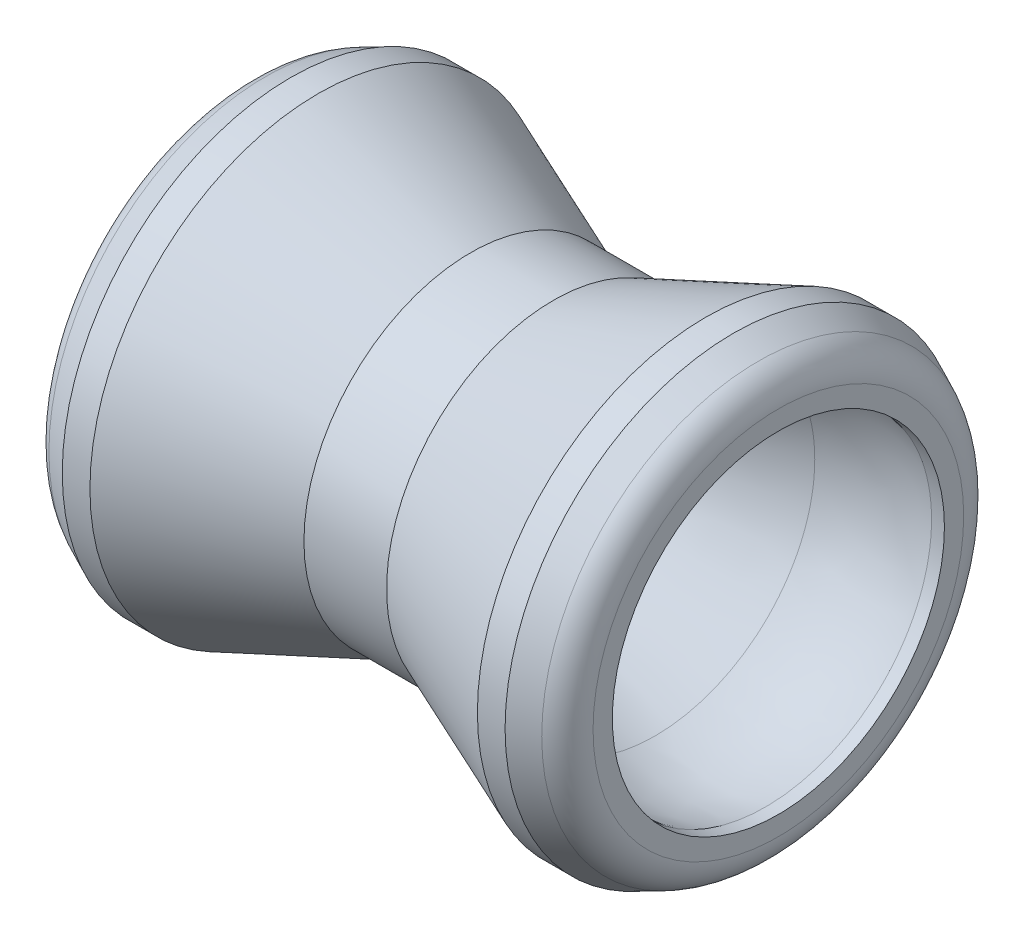
ISO-10303-21;
HEADER;
FILE_DESCRIPTION(('STEP AP214'),'2;1');
FILE_NAME('part.step','',(''),(''),'','','');
FILE_SCHEMA(('AUTOMOTIVE_DESIGN { 1 0 10303 214 1 1 1 1 }'));
ENDSEC;
DATA;
#1=APPLICATION_CONTEXT('core data for automotive mechanical design processes');
#2=APPLICATION_PROTOCOL_DEFINITION('international standard','automotive_design',2000,#1);
#3=PRODUCT_CONTEXT('',#1,'mechanical');
#4=PRODUCT('Part','Part','',(#3));
#5=PRODUCT_RELATED_PRODUCT_CATEGORY('part','',(#4));
#6=PRODUCT_DEFINITION_FORMATION('','',#4);
#7=PRODUCT_DEFINITION_CONTEXT('part definition',#1,'design');
#8=PRODUCT_DEFINITION('design','',#6,#7);
#9=PRODUCT_DEFINITION_SHAPE('','',#8);
#10=(LENGTH_UNIT() NAMED_UNIT(*) SI_UNIT(.MILLI.,.METRE.));
#11=(NAMED_UNIT(*) PLANE_ANGLE_UNIT() SI_UNIT($,.RADIAN.));
#12=(NAMED_UNIT(*) SI_UNIT($,.STERADIAN.) SOLID_ANGLE_UNIT());
#13=UNCERTAINTY_MEASURE_WITH_UNIT(LENGTH_MEASURE(1.E-05),#10,'distance_accuracy_value','');
#14=(GEOMETRIC_REPRESENTATION_CONTEXT(3) GLOBAL_UNCERTAINTY_ASSIGNED_CONTEXT((#13)) GLOBAL_UNIT_ASSIGNED_CONTEXT((#10,
#11,#12)) REPRESENTATION_CONTEXT('',''));
#15=CARTESIAN_POINT('',(0.,0.,0.));
#16=DIRECTION('',(0.,0.,1.));
#17=DIRECTION('',(1.,0.,0.));
#18=AXIS2_PLACEMENT_3D('',#15,#16,#17);
#19=CARTESIAN_POINT('',(-15.3949810712106,0.,0.));
#20=DIRECTION('',(-1.,0.,0.));
#21=DIRECTION('',(0.,0.,1.));
#22=AXIS2_PLACEMENT_3D('',#19,#20,#21);
#23=CONICAL_SURFACE('',#22,4.22106090000085,0.0220636833265446);
#24=CARTESIAN_POINT('',(-15.394981071271,0.,0.));
#25=DIRECTION('',(1.,0.,0.));
#26=DIRECTION('',(0.,0.,-1.));
#27=AXIS2_PLACEMENT_3D('',#24,#25,#26);
#28=CIRCLE('',#27,4.22106090000002);
#29=CARTESIAN_POINT('',(-15.394981071271,0.,-4.22106090000002));
#30=VERTEX_POINT('',#29);
#31=EDGE_CURVE('E91',#30,#30,#28,.T.);
#32=ORIENTED_EDGE('',*,*,#31,.F.);
#33=EDGE_LOOP('',(#32));
#34=FACE_BOUND('',#33,.T.);
#35=CARTESIAN_POINT('',(-9.81825898657007,0.,0.));
#36=DIRECTION('',(-1.,0.,0.));
#37=DIRECTION('',(0.,0.,1.));
#38=AXIS2_PLACEMENT_3D('',#35,#36,#37);
#39=CIRCLE('',#38,4.09799790000316);
#40=CARTESIAN_POINT('',(-9.81825898657007,0.,4.09799790000316));
#41=VERTEX_POINT('',#40);
#42=EDGE_CURVE('E92',#41,#41,#39,.T.);
#43=ORIENTED_EDGE('',*,*,#42,.F.);
#44=EDGE_LOOP('',(#43));
#45=FACE_BOUND('',#44,.T.);
#46=ADVANCED_FACE('F17',(#34,#45),#23,.F.);
#47=CARTESIAN_POINT('',(-9.81825898657293,0.,0.));
#48=DIRECTION('',(1.,0.,0.));
#49=DIRECTION('',(0.,0.,-1.));
#50=AXIS2_PLACEMENT_3D('',#47,#48,#49);
#51=PLANE('',#50);
#52=ORIENTED_EDGE('',*,*,#42,.T.);
#53=EDGE_LOOP('',(#52));
#54=FACE_BOUND('',#53,.T.);
#55=CARTESIAN_POINT('',(-9.81825898657293,0.,0.));
#56=DIRECTION('',(1.,0.,0.));
#57=DIRECTION('',(0.,0.,-1.));
#58=AXIS2_PLACEMENT_3D('',#55,#56,#57);
#59=CIRCLE('',#58,4.4056554);
#60=CARTESIAN_POINT('',(-9.81825898657293,0.,-4.4056554));
#61=VERTEX_POINT('',#60);
#62=EDGE_CURVE('E88',#61,#61,#59,.T.);
#63=ORIENTED_EDGE('',*,*,#62,.T.);
#64=EDGE_LOOP('',(#63));
#65=FACE_BOUND('',#64,.T.);
#66=ADVANCED_FACE('F273',(#54,#65),#51,.T.);
#67=CARTESIAN_POINT('',(-15.3906370668411,0.,0.));
#68=DIRECTION('',(1.,0.,0.));
#69=DIRECTION('',(0.,0.,-1.));
#70=AXIS2_PLACEMENT_3D('',#67,#68,#69);
#71=TOROIDAL_SURFACE('',#70,4.41791377568679,0.1969008);
#72=ORIENTED_EDGE('',*,*,#31,.T.);
#73=EDGE_LOOP('',(#72));
#74=FACE_BOUND('',#73,.T.);
#75=CARTESIAN_POINT('',(-15.4653340532218,0.,0.));
#76=DIRECTION('',(1.,0.,0.));
#77=DIRECTION('',(0.,0.,-1.));
#78=AXIS2_PLACEMENT_3D('',#75,#76,#77);
#79=CIRCLE('',#78,4.23573176431827);
#80=CARTESIAN_POINT('',(-15.4653340532218,0.,-4.23573176431827));
#81=VERTEX_POINT('',#80);
#82=EDGE_CURVE('E71',#81,#81,#79,.F.);
#83=ORIENTED_EDGE('',*,*,#82,.T.);
#84=EDGE_LOOP('',(#83));
#85=FACE_BOUND('',#84,.T.);
#86=ADVANCED_FACE('F270',(#74,#85),#71,.T.);
#87=CARTESIAN_POINT('',(-0.342407986572929,0.,0.));
#88=DIRECTION('',(1.,0.,0.));
#89=DIRECTION('',(0.,0.,-1.));
#90=AXIS2_PLACEMENT_3D('',#87,#88,#89);
#91=CYLINDRICAL_SURFACE('',#90,4.4056554);
#92=ORIENTED_EDGE('',*,*,#62,.F.);
#93=EDGE_LOOP('',(#92));
#94=FACE_BOUND('',#93,.T.);
#95=CARTESIAN_POINT('',(-7.89002856913612,0.,0.));
#96=DIRECTION('',(1.,0.,0.));
#97=DIRECTION('',(0.,0.,-1.));
#98=AXIS2_PLACEMENT_3D('',#95,#96,#97);
#99=CIRCLE('',#98,4.40565539997806);
#100=CARTESIAN_POINT('',(-7.89002856913612,0.,-4.40565539997806));
#101=VERTEX_POINT('',#100);
#102=EDGE_CURVE('E78',#101,#101,#99,.T.);
#103=ORIENTED_EDGE('',*,*,#102,.T.);
#104=EDGE_LOOP('',(#103));
#105=FACE_BOUND('',#104,.T.);
#106=ADVANCED_FACE('F67',(#94,#105),#91,.F.);
#107=CARTESIAN_POINT('',(-17.202038986573,0.,0.));
#108=DIRECTION('',(0.,0.,-1.));
#109=DIRECTION('',(-1.,0.,0.));
#110=AXIS2_PLACEMENT_3D('',#107,#108,#109);
#111=SPHERICAL_SURFACE('',#110,4.5779436);
#112=CARTESIAN_POINT('',(-17.202038986573,0.,-4.5779436));
#113=VERTEX_POINT('',#112);
#114=VERTEX_LOOP('',#113);
#115=FACE_BOUND('',#114,.T.);
#116=ORIENTED_EDGE('',*,*,#82,.F.);
#117=EDGE_LOOP('',(#116));
#118=FACE_BOUND('',#117,.T.);
#119=CARTESIAN_POINT('',(-17.202038986573,0.,4.5779436));
#120=VERTEX_POINT('',#119);
#121=VERTEX_LOOP('',#120);
#122=FACE_BOUND('',#121,.T.);
#123=CARTESIAN_POINT('',(-18.6170618351128,0.,0.));
#124=DIRECTION('',(1.,0.,0.));
#125=DIRECTION('',(0.,0.,-1.));
#126=AXIS2_PLACEMENT_3D('',#123,#124,#125);
#127=CIRCLE('',#126,4.35376594948453);
#128=CARTESIAN_POINT('',(-18.6170618351128,0.,-4.35376594948453));
#129=VERTEX_POINT('',#128);
#130=EDGE_CURVE('E75',#129,#129,#127,.T.);
#131=ORIENTED_EDGE('',*,*,#130,.F.);
#132=EDGE_LOOP('',(#131));
#133=FACE_BOUND('',#132,.T.);
#134=ADVANCED_FACE('F63',(#115,#118,#122,#133),#111,.F.);
#135=CARTESIAN_POINT('',(-4.73026950459143,0.,0.));
#136=DIRECTION('',(1.,0.,0.));
#137=DIRECTION('',(0.,0.,-1.));
#138=AXIS2_PLACEMENT_3D('',#135,#136,#137);
#139=CONICAL_SURFACE('',#138,5.68228092936352,0.383972435435771);
#140=ORIENTED_EDGE('',*,*,#102,.F.);
#141=EDGE_LOOP('',(#140));
#142=FACE_BOUND('',#141,.T.);
#143=CARTESIAN_POINT('',(-4.73026950459143,0.,0.));
#144=DIRECTION('',(1.,0.,0.));
#145=DIRECTION('',(0.,0.,-1.));
#146=AXIS2_PLACEMENT_3D('',#143,#144,#145);
#147=CIRCLE('',#146,5.68228092936352);
#148=CARTESIAN_POINT('',(-4.73026950459143,0.,-5.68228092936352));
#149=VERTEX_POINT('',#148);
#150=EDGE_CURVE('E77',#149,#149,#147,.T.);
#151=ORIENTED_EDGE('',*,*,#150,.T.);
#152=EDGE_LOOP('',(#151));
#153=FACE_BOUND('',#152,.T.);
#154=ADVANCED_FACE('F66',(#142,#153),#139,.F.);
#155=CARTESIAN_POINT('',(-18.6779230328995,0.,0.));
#156=DIRECTION('',(1.,0.,0.));
#157=DIRECTION('',(0.,0.,-1.));
#158=AXIS2_PLACEMENT_3D('',#155,#156,#157);
#159=TOROIDAL_SURFACE('',#158,4.5410247,0.1969008);
#160=ORIENTED_EDGE('',*,*,#130,.T.);
#161=EDGE_LOOP('',(#160));
#162=FACE_BOUND('',#161,.T.);
#163=CARTESIAN_POINT('',(-18.6779230328995,0.,0.));
#164=DIRECTION('',(1.,0.,0.));
#165=DIRECTION('',(0.,0.,-1.));
#166=AXIS2_PLACEMENT_3D('',#163,#164,#165);
#167=CIRCLE('',#166,4.3441239);
#168=CARTESIAN_POINT('',(-18.6779230328995,0.,-4.3441239));
#169=VERTEX_POINT('',#168);
#170=EDGE_CURVE('E81',#169,#169,#167,.F.);
#171=ORIENTED_EDGE('',*,*,#170,.T.);
#172=EDGE_LOOP('',(#171));
#173=FACE_BOUND('',#172,.T.);
#174=ADVANCED_FACE('F259',(#162,#173),#159,.T.);
#175=CARTESIAN_POINT('',(-2.43447898657293,0.,0.));
#176=DIRECTION('',(0.,0.,-1.));
#177=DIRECTION('',(-1.,0.,0.));
#178=AXIS2_PLACEMENT_3D('',#175,#176,#177);
#179=SPHERICAL_SURFACE('',#178,6.1285374);
#180=CARTESIAN_POINT('',(-2.43447898657293,0.,-6.1285374));
#181=VERTEX_POINT('',#180);
#182=VERTEX_LOOP('',#181);
#183=FACE_BOUND('',#182,.T.);
#184=ORIENTED_EDGE('',*,*,#150,.F.);
#185=EDGE_LOOP('',(#184));
#186=FACE_BOUND('',#185,.T.);
#187=CARTESIAN_POINT('',(-2.43447898657293,0.,6.1285374));
#188=VERTEX_POINT('',#187);
#189=VERTEX_LOOP('',#188);
#190=FACE_BOUND('',#189,.T.);
#191=CARTESIAN_POINT('',(-0.801678286357883,0.,0.));
#192=DIRECTION('',(1.,0.,0.));
#193=DIRECTION('',(0.,0.,-1.));
#194=AXIS2_PLACEMENT_3D('',#191,#192,#193);
#195=CIRCLE('',#194,5.907024);
#196=CARTESIAN_POINT('',(-0.801678286357883,0.,-5.907024));
#197=VERTEX_POINT('',#196);
#198=EDGE_CURVE('E250',#197,#197,#195,.T.);
#199=ORIENTED_EDGE('',*,*,#198,.T.);
#200=EDGE_LOOP('',(#199));
#201=FACE_BOUND('',#200,.T.);
#202=ADVANCED_FACE('F255',(#183,#186,#190,#201),#179,.F.);
#203=CARTESIAN_POINT('',(-0.342407986572929,0.,0.));
#204=DIRECTION('',(1.,0.,0.));
#205=DIRECTION('',(0.,0.,-1.));
#206=AXIS2_PLACEMENT_3D('',#203,#204,#205);
#207=CYLINDRICAL_SURFACE('',#206,4.3441239);
#208=ORIENTED_EDGE('',*,*,#170,.F.);
#209=EDGE_LOOP('',(#208));
#210=FACE_BOUND('',#209,.T.);
#211=CARTESIAN_POINT('',(-19.0156502047708,0.,0.));
#212=DIRECTION('',(1.,0.,0.));
#213=DIRECTION('',(0.,0.,-1.));
#214=AXIS2_PLACEMENT_3D('',#211,#212,#213);
#215=CIRCLE('',#214,4.3441239);
#216=CARTESIAN_POINT('',(-19.0156502047708,0.,-4.3441239));
#217=VERTEX_POINT('',#216);
#218=EDGE_CURVE('E247',#217,#217,#215,.T.);
#219=ORIENTED_EDGE('',*,*,#218,.F.);
#220=EDGE_LOOP('',(#219));
#221=FACE_BOUND('',#220,.T.);
#222=ADVANCED_FACE('F258',(#210,#221),#207,.F.);
#223=CARTESIAN_POINT('',(-0.342407986572929,0.,0.));
#224=DIRECTION('',(1.,0.,0.));
#225=DIRECTION('',(0.,0.,-1.));
#226=AXIS2_PLACEMENT_3D('',#223,#224,#225);
#227=CYLINDRICAL_SURFACE('',#226,5.907024);
#228=ORIENTED_EDGE('',*,*,#198,.F.);
#229=EDGE_LOOP('',(#228));
#230=FACE_BOUND('',#229,.T.);
#231=CARTESIAN_POINT('',(-0.342407986572929,0.,0.));
#232=DIRECTION('',(1.,0.,0.));
#233=DIRECTION('',(0.,0.,-1.));
#234=AXIS2_PLACEMENT_3D('',#231,#232,#233);
#235=CIRCLE('',#234,5.907024);
#236=CARTESIAN_POINT('',(-0.342407986572929,0.,-5.907024));
#237=VERTEX_POINT('',#236);
#238=EDGE_CURVE('E246',#237,#237,#235,.T.);
#239=ORIENTED_EDGE('',*,*,#238,.T.);
#240=EDGE_LOOP('',(#239));
#241=FACE_BOUND('',#240,.T.);
#242=ADVANCED_FACE('F237',(#230,#241),#227,.F.);
#243=CARTESIAN_POINT('',(-19.0156502047708,0.,0.));
#244=DIRECTION('',(1.,0.,0.));
#245=DIRECTION('',(0.,0.,-1.));
#246=AXIS2_PLACEMENT_3D('',#243,#244,#245);
#247=TOROIDAL_SURFACE('',#246,4.5410247,0.1969008);
#248=ORIENTED_EDGE('',*,*,#218,.T.);
#249=EDGE_LOOP('',(#248));
#250=FACE_BOUND('',#249,.T.);
#251=CARTESIAN_POINT('',(-19.1341480642677,0.,0.));
#252=DIRECTION('',(-1.,0.,0.));
#253=DIRECTION('',(0.,0.,1.));
#254=AXIS2_PLACEMENT_3D('',#251,#252,#253);
#255=CIRCLE('',#254,4.38377272922707);
#256=CARTESIAN_POINT('',(-19.1341480642677,0.,4.38377272922707));
#257=VERTEX_POINT('',#256);
#258=EDGE_CURVE('E210',#257,#257,#255,.T.);
#259=ORIENTED_EDGE('',*,*,#258,.T.);
#260=EDGE_LOOP('',(#259));
#261=FACE_BOUND('',#260,.T.);
#262=ADVANCED_FACE('F232',(#250,#261),#247,.T.);
#263=CARTESIAN_POINT('',(-0.342407986572929,0.,0.));
#264=DIRECTION('',(-1.,0.,0.));
#265=DIRECTION('',(0.,0.,1.));
#266=AXIS2_PLACEMENT_3D('',#263,#264,#265);
#267=PLANE('',#266);
#268=CARTESIAN_POINT('',(-0.34240798657293,0.,0.));
#269=DIRECTION('',(-1.,0.,0.));
#270=DIRECTION('',(0.,0.,-1.));
#271=AXIS2_PLACEMENT_3D('',#268,#269,#270);
#272=CIRCLE('',#271,6.59215237358061);
#273=CARTESIAN_POINT('',(-0.34240798657293,0.,-6.59215237358061));
#274=VERTEX_POINT('',#273);
#275=CARTESIAN_POINT('',(-0.34240798657293,0.,6.59215237358061));
#276=VERTEX_POINT('',#275);
#277=EDGE_CURVE('E203',#274,#276,#272,.T.);
#278=ORIENTED_EDGE('',*,*,#277,.F.);
#279=CARTESIAN_POINT('',(-0.34240798657293,0.,0.));
#280=DIRECTION('',(-1.,0.,0.));
#281=DIRECTION('',(0.,0.,1.));
#282=AXIS2_PLACEMENT_3D('',#279,#280,#281);
#283=CIRCLE('',#282,6.59215237358061);
#284=EDGE_CURVE('E206',#276,#274,#283,.T.);
#285=ORIENTED_EDGE('',*,*,#284,.F.);
#286=EDGE_LOOP('',(#278,#285));
#287=FACE_BOUND('',#286,.T.);
#288=ORIENTED_EDGE('',*,*,#238,.F.);
#289=EDGE_LOOP('',(#288));
#290=FACE_BOUND('',#289,.T.);
#291=ADVANCED_FACE('F212',(#287,#290),#267,.F.);
#292=CARTESIAN_POINT('',(-19.2157070459871,0.,0.));
#293=DIRECTION('',(-1.,0.,0.));
#294=DIRECTION('',(0.,0.,1.));
#295=AXIS2_PLACEMENT_3D('',#292,#293,#294);
#296=CONICAL_SURFACE('',#295,4.44523183017509,0.645771823409847);
#297=CARTESIAN_POINT('',(-19.2157070460836,0.,0.));
#298=DIRECTION('',(1.,0.,0.));
#299=DIRECTION('',(0.,0.,-1.));
#300=AXIS2_PLACEMENT_3D('',#297,#298,#299);
#301=CIRCLE('',#300,4.44523183022253);
#302=CARTESIAN_POINT('',(-19.2157070460836,0.,-4.44523183022253));
#303=VERTEX_POINT('',#302);
#304=EDGE_CURVE('E214',#303,#303,#301,.T.);
#305=ORIENTED_EDGE('',*,*,#304,.F.);
#306=EDGE_LOOP('',(#305));
#307=FACE_BOUND('',#306,.T.);
#308=ORIENTED_EDGE('',*,*,#258,.F.);
#309=EDGE_LOOP('',(#308));
#310=FACE_BOUND('',#309,.T.);
#311=ADVANCED_FACE('F231',(#307,#310),#296,.F.);
#312=CARTESIAN_POINT('',(-1.57303798657293,0.,0.));
#313=DIRECTION('',(1.,0.,0.));
#314=DIRECTION('',(0.,0.,-1.));
#315=AXIS2_PLACEMENT_3D('',#312,#313,#314);
#316=TOROIDAL_SURFACE('',#315,6.59215237358061,1.23063);
#317=ORIENTED_EDGE('',*,*,#277,.T.);
#318=ORIENTED_EDGE('',*,*,#284,.T.);
#319=EDGE_LOOP('',(#317,#318));
#320=FACE_BOUND('',#319,.T.);
#321=CARTESIAN_POINT('',(-1.05295127512698,0.,0.));
#322=DIRECTION('',(-1.,0.,0.));
#323=DIRECTION('',(0.,0.,1.));
#324=AXIS2_PLACEMENT_3D('',#321,#322,#323);
#325=CIRCLE('',#324,7.70748192554153);
#326=CARTESIAN_POINT('',(-1.05295127512698,0.,7.70748192554153));
#327=VERTEX_POINT('',#326);
#328=EDGE_CURVE('E243',#327,#327,#325,.T.);
#329=ORIENTED_EDGE('',*,*,#328,.F.);
#330=EDGE_LOOP('',(#329));
#331=FACE_BOUND('',#330,.T.);
#332=ADVANCED_FACE('F186',(#320,#331),#316,.T.);
#333=CARTESIAN_POINT('',(-19.097209186573,0.,0.));
#334=DIRECTION('',(1.,0.,0.));
#335=DIRECTION('',(0.,0.,-1.));
#336=AXIS2_PLACEMENT_3D('',#333,#334,#335);
#337=TOROIDAL_SURFACE('',#336,4.60248380105924,0.1969008);
#338=ORIENTED_EDGE('',*,*,#304,.T.);
#339=EDGE_LOOP('',(#338));
#340=FACE_BOUND('',#339,.T.);
#341=CARTESIAN_POINT('',(-19.294109986573,0.,0.));
#342=DIRECTION('',(-1.,0.,0.));
#343=DIRECTION('',(0.,0.,-1.));
#344=AXIS2_PLACEMENT_3D('',#341,#342,#343);
#345=CIRCLE('',#344,4.60248380105924);
#346=CARTESIAN_POINT('',(-19.294109986573,0.,4.60248380105924));
#347=VERTEX_POINT('',#346);
#348=CARTESIAN_POINT('',(-19.294109986573,0.,-4.60248380105924));
#349=VERTEX_POINT('',#348);
#350=EDGE_CURVE('E356',#347,#349,#345,.F.);
#351=ORIENTED_EDGE('',*,*,#350,.F.);
#352=CARTESIAN_POINT('',(-19.294109986573,0.,0.));
#353=DIRECTION('',(-1.,0.,0.));
#354=DIRECTION('',(0.,0.,1.));
#355=AXIS2_PLACEMENT_3D('',#352,#353,#354);
#356=CIRCLE('',#355,4.60248380105924);
#357=EDGE_CURVE('E133',#349,#347,#356,.F.);
#358=ORIENTED_EDGE('',*,*,#357,.F.);
#359=EDGE_LOOP('',(#351,#358));
#360=FACE_BOUND('',#359,.T.);
#361=ADVANCED_FACE('F183',(#340,#360),#337,.T.);
#362=CARTESIAN_POINT('',(-1.94222698657293,0.,0.));
#363=DIRECTION('',(-1.,0.,0.));
#364=DIRECTION('',(0.,0.,1.));
#365=AXIS2_PLACEMENT_3D('',#362,#363,#364);
#366=CONICAL_SURFACE('',#365,8.122158,0.436332312998578);
#367=CARTESIAN_POINT('',(-1.94222698657293,0.,0.));
#368=DIRECTION('',(1.,0.,0.));
#369=DIRECTION('',(0.,0.,-1.));
#370=AXIS2_PLACEMENT_3D('',#367,#368,#369);
#371=CIRCLE('',#370,8.122158);
#372=CARTESIAN_POINT('',(-1.94222698657293,0.,-8.122158));
#373=VERTEX_POINT('',#372);
#374=EDGE_CURVE('E125',#373,#373,#371,.F.);
#375=ORIENTED_EDGE('',*,*,#374,.F.);
#376=EDGE_LOOP('',(#375));
#377=FACE_BOUND('',#376,.T.);
#378=ORIENTED_EDGE('',*,*,#328,.T.);
#379=EDGE_LOOP('',(#378));
#380=FACE_BOUND('',#379,.T.);
#381=ADVANCED_FACE('F147',(#377,#380),#366,.T.);
#382=CARTESIAN_POINT('',(-19.294109986573,0.,0.));
#383=DIRECTION('',(-1.,0.,0.));
#384=DIRECTION('',(0.,0.,1.));
#385=AXIS2_PLACEMENT_3D('',#382,#383,#384);
#386=PLANE('',#385);
#387=CARTESIAN_POINT('',(-19.294109986573,0.,0.));
#388=DIRECTION('',(1.,0.,0.));
#389=DIRECTION('',(0.,0.,-1.));
#390=AXIS2_PLACEMENT_3D('',#387,#388,#389);
#391=CIRCLE('',#390,6.59215237358061);
#392=CARTESIAN_POINT('',(-19.294109986573,0.,-6.59215237358061));
#393=VERTEX_POINT('',#392);
#394=CARTESIAN_POINT('',(-19.294109986573,0.,6.59215237358061));
#395=VERTEX_POINT('',#394);
#396=EDGE_CURVE('E128',#393,#395,#391,.T.);
#397=ORIENTED_EDGE('',*,*,#396,.F.);
#398=CARTESIAN_POINT('',(-19.294109986573,0.,0.));
#399=DIRECTION('',(1.,0.,0.));
#400=DIRECTION('',(0.,0.,1.));
#401=AXIS2_PLACEMENT_3D('',#398,#399,#400);
#402=CIRCLE('',#401,6.59215237358061);
#403=EDGE_CURVE('E36',#395,#393,#402,.T.);
#404=ORIENTED_EDGE('',*,*,#403,.F.);
#405=EDGE_LOOP('',(#397,#404));
#406=FACE_BOUND('',#405,.T.);
#407=ORIENTED_EDGE('',*,*,#357,.T.);
#408=ORIENTED_EDGE('',*,*,#350,.T.);
#409=EDGE_LOOP('',(#407,#408));
#410=FACE_BOUND('',#409,.T.);
#411=ADVANCED_FACE('F138',(#406,#410),#386,.T.);
#412=CARTESIAN_POINT('',(-0.342407986572929,0.,0.));
#413=DIRECTION('',(1.,0.,0.));
#414=DIRECTION('',(0.,0.,-1.));
#415=AXIS2_PLACEMENT_3D('',#412,#413,#414);
#416=CYLINDRICAL_SURFACE('',#415,8.122158);
#417=ORIENTED_EDGE('',*,*,#374,.T.);
#418=EDGE_LOOP('',(#417));
#419=FACE_BOUND('',#418,.T.);
#420=CARTESIAN_POINT('',(-2.92673098657293,0.,0.));
#421=DIRECTION('',(1.,0.,0.));
#422=DIRECTION('',(0.,0.,-1.));
#423=AXIS2_PLACEMENT_3D('',#420,#421,#422);
#424=CIRCLE('',#423,8.122158);
#425=CARTESIAN_POINT('',(-2.92673098657293,0.,-8.122158));
#426=VERTEX_POINT('',#425);
#427=EDGE_CURVE('E123',#426,#426,#424,.F.);
#428=ORIENTED_EDGE('',*,*,#427,.F.);
#429=EDGE_LOOP('',(#428));
#430=FACE_BOUND('',#429,.T.);
#431=ADVANCED_FACE('F114',(#419,#430),#416,.T.);
#432=CARTESIAN_POINT('',(-18.063479986573,0.,0.));
#433=DIRECTION('',(1.,0.,0.));
#434=DIRECTION('',(0.,0.,-1.));
#435=AXIS2_PLACEMENT_3D('',#432,#433,#434);
#436=TOROIDAL_SURFACE('',#435,6.59215237358061,1.23063);
#437=CARTESIAN_POINT('',(-18.5835666980189,0.,0.));
#438=DIRECTION('',(1.,0.,0.));
#439=DIRECTION('',(0.,0.,-1.));
#440=AXIS2_PLACEMENT_3D('',#437,#438,#439);
#441=CIRCLE('',#440,7.70748192554152);
#442=CARTESIAN_POINT('',(-18.5835666980189,0.,-7.70748192554152));
#443=VERTEX_POINT('',#442);
#444=EDGE_CURVE('E331',#443,#443,#441,.T.);
#445=ORIENTED_EDGE('',*,*,#444,.F.);
#446=EDGE_LOOP('',(#445));
#447=FACE_BOUND('',#446,.T.);
#448=ORIENTED_EDGE('',*,*,#396,.T.);
#449=ORIENTED_EDGE('',*,*,#403,.T.);
#450=EDGE_LOOP('',(#448,#449));
#451=FACE_BOUND('',#450,.T.);
#452=ADVANCED_FACE('F102',(#447,#451),#436,.T.);
#453=CARTESIAN_POINT('',(-2.92673098657293,0.,0.));
#454=DIRECTION('',(1.,0.,0.));
#455=DIRECTION('',(0.,0.,-1.));
#456=AXIS2_PLACEMENT_3D('',#453,#454,#455);
#457=CONICAL_SURFACE('',#456,8.122158,0.383972435438746);
#458=ORIENTED_EDGE('',*,*,#427,.T.);
#459=EDGE_LOOP('',(#458));
#460=FACE_BOUND('',#459,.T.);
#461=CARTESIAN_POINT('',(-8.3484617058401,0.,0.));
#462=DIRECTION('',(1.,0.,0.));
#463=DIRECTION('',(0.,0.,-1.));
#464=AXIS2_PLACEMENT_3D('',#461,#462,#463);
#465=CIRCLE('',#464,5.9316366);
#466=CARTESIAN_POINT('',(-8.3484617058401,0.,-5.9316366));
#467=VERTEX_POINT('',#466);
#468=EDGE_CURVE('E332',#467,#467,#465,.F.);
#469=ORIENTED_EDGE('',*,*,#468,.F.);
#470=EDGE_LOOP('',(#469));
#471=FACE_BOUND('',#470,.T.);
#472=ADVANCED_FACE('F113',(#460,#471),#457,.T.);
#473=CARTESIAN_POINT('',(-17.6942909865729,0.,0.));
#474=DIRECTION('',(1.,0.,0.));
#475=DIRECTION('',(0.,0.,-1.));
#476=AXIS2_PLACEMENT_3D('',#473,#474,#475);
#477=CONICAL_SURFACE('',#476,8.122158,0.436332312998577);
#478=CARTESIAN_POINT('',(-17.6942909865729,0.,0.));
#479=DIRECTION('',(1.,0.,0.));
#480=DIRECTION('',(0.,0.,-1.));
#481=AXIS2_PLACEMENT_3D('',#478,#479,#480);
#482=CIRCLE('',#481,8.122158);
#483=CARTESIAN_POINT('',(-17.6942909865729,0.,-8.122158));
#484=VERTEX_POINT('',#483);
#485=EDGE_CURVE('E328',#484,#484,#482,.T.);
#486=ORIENTED_EDGE('',*,*,#485,.F.);
#487=EDGE_LOOP('',(#486));
#488=FACE_BOUND('',#487,.T.);
#489=ORIENTED_EDGE('',*,*,#444,.T.);
#490=EDGE_LOOP('',(#489));
#491=FACE_BOUND('',#490,.T.);
#492=ADVANCED_FACE('F316',(#488,#491),#477,.T.);
#493=CARTESIAN_POINT('',(-0.342407986572929,0.,0.));
#494=DIRECTION('',(1.,0.,0.));
#495=DIRECTION('',(0.,0.,-1.));
#496=AXIS2_PLACEMENT_3D('',#493,#494,#495);
#497=CYLINDRICAL_SURFACE('',#496,5.9316366);
#498=ORIENTED_EDGE('',*,*,#468,.T.);
#499=EDGE_LOOP('',(#498));
#500=FACE_BOUND('',#499,.T.);
#501=CARTESIAN_POINT('',(-11.2880562673058,0.,0.));
#502=DIRECTION('',(-1.,0.,0.));
#503=DIRECTION('',(0.,0.,1.));
#504=AXIS2_PLACEMENT_3D('',#501,#502,#503);
#505=CIRCLE('',#504,5.9316366);
#506=CARTESIAN_POINT('',(-11.2880562673058,0.,5.9316366));
#507=VERTEX_POINT('',#506);
#508=EDGE_CURVE('E28',#507,#507,#505,.T.);
#509=ORIENTED_EDGE('',*,*,#508,.F.);
#510=EDGE_LOOP('',(#509));
#511=FACE_BOUND('',#510,.T.);
#512=ADVANCED_FACE('F310',(#500,#511),#497,.T.);
#513=CARTESIAN_POINT('',(-0.342407986572929,0.,0.));
#514=DIRECTION('',(1.,0.,0.));
#515=DIRECTION('',(0.,0.,-1.));
#516=AXIS2_PLACEMENT_3D('',#513,#514,#515);
#517=CYLINDRICAL_SURFACE('',#516,8.122158);
#518=CARTESIAN_POINT('',(-16.709786986573,0.,0.));
#519=DIRECTION('',(-1.,0.,0.));
#520=DIRECTION('',(0.,0.,1.));
#521=AXIS2_PLACEMENT_3D('',#518,#519,#520);
#522=CIRCLE('',#521,8.122158);
#523=CARTESIAN_POINT('',(-16.709786986573,0.,8.122158));
#524=VERTEX_POINT('',#523);
#525=EDGE_CURVE('E11',#524,#524,#522,.F.);
#526=ORIENTED_EDGE('',*,*,#525,.F.);
#527=EDGE_LOOP('',(#526));
#528=FACE_BOUND('',#527,.T.);
#529=ORIENTED_EDGE('',*,*,#485,.T.);
#530=EDGE_LOOP('',(#529));
#531=FACE_BOUND('',#530,.T.);
#532=ADVANCED_FACE('F303',(#528,#531),#517,.T.);
#533=CARTESIAN_POINT('',(-16.709786986573,0.,0.));
#534=DIRECTION('',(-1.,0.,0.));
#535=DIRECTION('',(0.,0.,1.));
#536=AXIS2_PLACEMENT_3D('',#533,#534,#535);
#537=CONICAL_SURFACE('',#536,8.122158,0.383972435438745);
#538=ORIENTED_EDGE('',*,*,#525,.T.);
#539=EDGE_LOOP('',(#538));
#540=FACE_BOUND('',#539,.T.);
#541=ORIENTED_EDGE('',*,*,#508,.T.);
#542=EDGE_LOOP('',(#541));
#543=FACE_BOUND('',#542,.T.);
#544=ADVANCED_FACE('F301',(#540,#543),#537,.T.);
#545=CLOSED_SHELL('',(#46,#66,#86,#106,#134,#154,#174,#202,#222,#242,#262,#291,#311,#332,#361,
#381,#411,#431,#452,#472,#492,#512,#532,#544));
#546=MANIFOLD_SOLID_BREP('B1',#545);
#547=ADVANCED_BREP_SHAPE_REPRESENTATION('',(#18,#546),#14);
#548=SHAPE_DEFINITION_REPRESENTATION(#9,#547);
ENDSEC;
END-ISO-10303-21;
